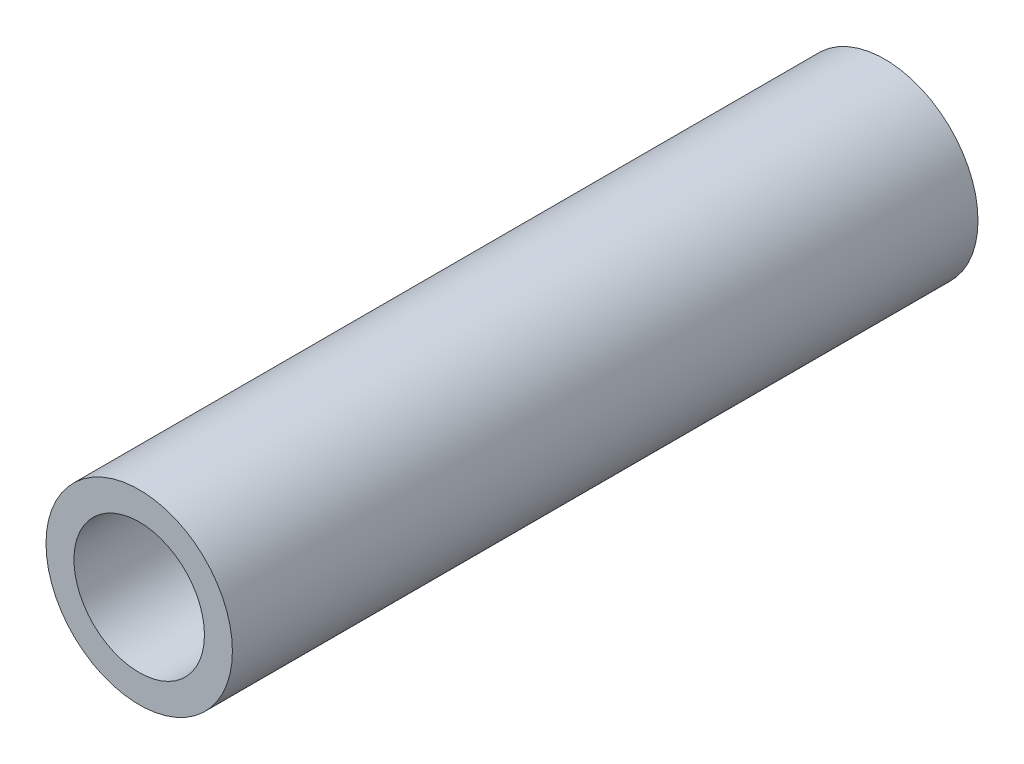
ISO-10303-21;
HEADER;
FILE_DESCRIPTION(('STEP AP214'),'2;1');
FILE_NAME('part.step','',(''),(''),'','','');
FILE_SCHEMA(('AUTOMOTIVE_DESIGN { 1 0 10303 214 1 1 1 1 }'));
ENDSEC;
DATA;
#1=APPLICATION_CONTEXT('core data for automotive mechanical design processes');
#2=APPLICATION_PROTOCOL_DEFINITION('international standard','automotive_design',2000,#1);
#3=PRODUCT_CONTEXT('',#1,'mechanical');
#4=PRODUCT('Part','Part','',(#3));
#5=PRODUCT_RELATED_PRODUCT_CATEGORY('part','',(#4));
#6=PRODUCT_DEFINITION_FORMATION('','',#4);
#7=PRODUCT_DEFINITION_CONTEXT('part definition',#1,'design');
#8=PRODUCT_DEFINITION('design','',#6,#7);
#9=PRODUCT_DEFINITION_SHAPE('','',#8);
#10=(LENGTH_UNIT() NAMED_UNIT(*) SI_UNIT(.MILLI.,.METRE.));
#11=(NAMED_UNIT(*) PLANE_ANGLE_UNIT() SI_UNIT($,.RADIAN.));
#12=(NAMED_UNIT(*) SI_UNIT($,.STERADIAN.) SOLID_ANGLE_UNIT());
#13=UNCERTAINTY_MEASURE_WITH_UNIT(LENGTH_MEASURE(1.E-05),#10,'distance_accuracy_value','');
#14=(GEOMETRIC_REPRESENTATION_CONTEXT(3) GLOBAL_UNCERTAINTY_ASSIGNED_CONTEXT((#13)) GLOBAL_UNIT_ASSIGNED_CONTEXT((#10,
#11,#12)) REPRESENTATION_CONTEXT('',''));
#15=CARTESIAN_POINT('',(0.,0.,0.));
#16=DIRECTION('',(0.,0.,1.));
#17=DIRECTION('',(1.,0.,0.));
#18=AXIS2_PLACEMENT_3D('',#15,#16,#17);
#19=CARTESIAN_POINT('',(0.,0.,16.));
#20=DIRECTION('',(0.,0.,1.));
#21=DIRECTION('',(1.,0.,0.));
#22=AXIS2_PLACEMENT_3D('',#19,#20,#21);
#23=PLANE('',#22);
#24=CARTESIAN_POINT('',(0.,0.,16.));
#25=DIRECTION('',(0.,0.,1.));
#26=DIRECTION('',(1.,0.,0.));
#27=AXIS2_PLACEMENT_3D('',#24,#25,#26);
#28=CIRCLE('',#27,2.);
#29=CARTESIAN_POINT('',(2.,0.,16.));
#30=VERTEX_POINT('',#29);
#31=EDGE_CURVE('E10',#30,#30,#28,.T.);
#32=ORIENTED_EDGE('',*,*,#31,.T.);
#33=EDGE_LOOP('',(#32));
#34=FACE_BOUND('',#33,.T.);
#35=CARTESIAN_POINT('',(0.,0.,16.));
#36=DIRECTION('',(0.,0.,1.));
#37=DIRECTION('',(1.,0.,0.));
#38=AXIS2_PLACEMENT_3D('',#35,#36,#37);
#39=CIRCLE('',#38,1.4);
#40=CARTESIAN_POINT('',(1.4,0.,16.));
#41=VERTEX_POINT('',#40);
#42=EDGE_CURVE('E54',#41,#41,#39,.T.);
#43=ORIENTED_EDGE('',*,*,#42,.F.);
#44=EDGE_LOOP('',(#43));
#45=FACE_BOUND('',#44,.T.);
#46=ADVANCED_FACE('F41',(#34,#45),#23,.T.);
#47=CARTESIAN_POINT('',(0.,0.,0.));
#48=DIRECTION('',(0.,0.,1.));
#49=DIRECTION('',(1.,0.,0.));
#50=AXIS2_PLACEMENT_3D('',#47,#48,#49);
#51=PLANE('',#50);
#52=CARTESIAN_POINT('',(0.,0.,0.));
#53=DIRECTION('',(0.,0.,1.));
#54=DIRECTION('',(1.,0.,0.));
#55=AXIS2_PLACEMENT_3D('',#52,#53,#54);
#56=CIRCLE('',#55,2.);
#57=CARTESIAN_POINT('',(2.,0.,0.));
#58=VERTEX_POINT('',#57);
#59=EDGE_CURVE('E45',#58,#58,#56,.T.);
#60=ORIENTED_EDGE('',*,*,#59,.F.);
#61=EDGE_LOOP('',(#60));
#62=FACE_BOUND('',#61,.T.);
#63=CARTESIAN_POINT('',(0.,0.,0.));
#64=DIRECTION('',(0.,0.,1.));
#65=DIRECTION('',(1.,0.,0.));
#66=AXIS2_PLACEMENT_3D('',#63,#64,#65);
#67=CIRCLE('',#66,1.4);
#68=CARTESIAN_POINT('',(1.4,0.,0.));
#69=VERTEX_POINT('',#68);
#70=EDGE_CURVE('E56',#69,#69,#67,.T.);
#71=ORIENTED_EDGE('',*,*,#70,.T.);
#72=EDGE_LOOP('',(#71));
#73=FACE_BOUND('',#72,.T.);
#74=ADVANCED_FACE('F68',(#62,#73),#51,.F.);
#75=CARTESIAN_POINT('',(0.,0.,16.));
#76=DIRECTION('',(0.,0.,-1.));
#77=DIRECTION('',(-1.,0.,0.));
#78=AXIS2_PLACEMENT_3D('',#75,#76,#77);
#79=CYLINDRICAL_SURFACE('',#78,2.);
#80=ORIENTED_EDGE('',*,*,#31,.F.);
#81=EDGE_LOOP('',(#80));
#82=FACE_BOUND('',#81,.T.);
#83=ORIENTED_EDGE('',*,*,#59,.T.);
#84=EDGE_LOOP('',(#83));
#85=FACE_BOUND('',#84,.T.);
#86=ADVANCED_FACE('F43',(#82,#85),#79,.T.);
#87=CARTESIAN_POINT('',(0.,0.,16.));
#88=DIRECTION('',(0.,0.,-1.));
#89=DIRECTION('',(-1.,0.,0.));
#90=AXIS2_PLACEMENT_3D('',#87,#88,#89);
#91=CYLINDRICAL_SURFACE('',#90,1.4);
#92=ORIENTED_EDGE('',*,*,#42,.T.);
#93=EDGE_LOOP('',(#92));
#94=FACE_BOUND('',#93,.T.);
#95=ORIENTED_EDGE('',*,*,#70,.F.);
#96=EDGE_LOOP('',(#95));
#97=FACE_BOUND('',#96,.T.);
#98=ADVANCED_FACE('F64',(#94,#97),#91,.F.);
#99=CLOSED_SHELL('',(#46,#74,#86,#98));
#100=MANIFOLD_SOLID_BREP('B2',#99);
#101=ADVANCED_BREP_SHAPE_REPRESENTATION('',(#18,#100),#14);
#102=SHAPE_DEFINITION_REPRESENTATION(#9,#101);
ENDSEC;
END-ISO-10303-21;
